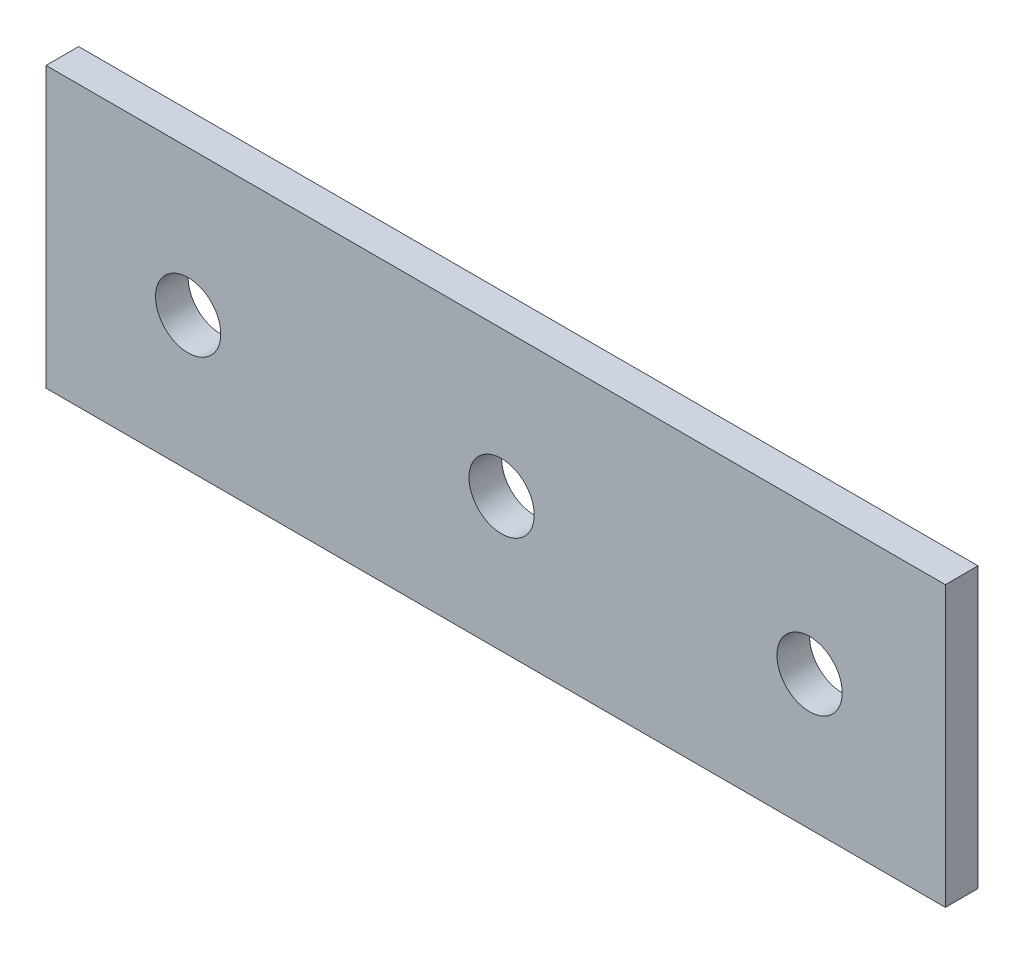
ISO-10303-21;
HEADER;
FILE_DESCRIPTION(('STEP AP214'),'2;1');
FILE_NAME('part.step','',(''),(''),'','','');
FILE_SCHEMA(('AUTOMOTIVE_DESIGN { 1 0 10303 214 1 1 1 1 }'));
ENDSEC;
DATA;
#1=APPLICATION_CONTEXT('core data for automotive mechanical design processes');
#2=APPLICATION_PROTOCOL_DEFINITION('international standard','automotive_design',2000,#1);
#3=PRODUCT_CONTEXT('',#1,'mechanical');
#4=PRODUCT('Part','Part','',(#3));
#5=PRODUCT_RELATED_PRODUCT_CATEGORY('part','',(#4));
#6=PRODUCT_DEFINITION_FORMATION('','',#4);
#7=PRODUCT_DEFINITION_CONTEXT('part definition',#1,'design');
#8=PRODUCT_DEFINITION('design','',#6,#7);
#9=PRODUCT_DEFINITION_SHAPE('','',#8);
#10=(LENGTH_UNIT() NAMED_UNIT(*) SI_UNIT(.MILLI.,.METRE.));
#11=(NAMED_UNIT(*) PLANE_ANGLE_UNIT() SI_UNIT($,.RADIAN.));
#12=(NAMED_UNIT(*) SI_UNIT($,.STERADIAN.) SOLID_ANGLE_UNIT());
#13=UNCERTAINTY_MEASURE_WITH_UNIT(LENGTH_MEASURE(1.E-05),#10,'distance_accuracy_value','');
#14=(GEOMETRIC_REPRESENTATION_CONTEXT(3) GLOBAL_UNCERTAINTY_ASSIGNED_CONTEXT((#13)) GLOBAL_UNIT_ASSIGNED_CONTEXT((#10,
#11,#12)) REPRESENTATION_CONTEXT('',''));
#15=CARTESIAN_POINT('',(0.,0.,0.));
#16=DIRECTION('',(0.,0.,1.));
#17=DIRECTION('',(1.,0.,0.));
#18=AXIS2_PLACEMENT_3D('',#15,#16,#17);
#19=CARTESIAN_POINT('',(0.,0.,10.));
#20=DIRECTION('',(0.,0.,1.));
#21=DIRECTION('',(1.,0.,0.));
#22=AXIS2_PLACEMENT_3D('',#19,#20,#21);
#23=PLANE('',#22);
#24=CARTESIAN_POINT('',(37.9860326953949,9.07309698138412,10.));
#25=DIRECTION('',(0.,0.,1.));
#26=DIRECTION('',(1.,0.,0.));
#27=AXIS2_PLACEMENT_3D('',#24,#25,#26);
#28=CIRCLE('',#27,10.);
#29=CARTESIAN_POINT('',(47.9860326953949,9.07309698138412,10.));
#30=VERTEX_POINT('',#29);
#31=EDGE_CURVE('E119',#30,#30,#28,.T.);
#32=ORIENTED_EDGE('',*,*,#31,.F.);
#33=EDGE_LOOP('',(#32));
#34=FACE_BOUND('',#33,.T.);
#35=DIRECTION('',(0.,-1.,0.));
#36=VECTOR('',#35,1.);
#37=CARTESIAN_POINT('',(-101.618686191502,53.5917595033755,10.));
#38=LINE('',#37,#36);
#39=CARTESIAN_POINT('',(-101.618686191502,53.5917595033755,10.));
#40=VERTEX_POINT('',#39);
#41=CARTESIAN_POINT('',(-101.618686191502,-32.0582760008906,10.));
#42=VERTEX_POINT('',#41);
#43=EDGE_CURVE('E89',#40,#42,#38,.T.);
#44=ORIENTED_EDGE('',*,*,#43,.T.);
#45=DIRECTION('',(1.,0.,0.));
#46=VECTOR('',#45,1.);
#47=CARTESIAN_POINT('',(-101.618686191502,-32.0582760008906,10.));
#48=LINE('',#47,#46);
#49=CARTESIAN_POINT('',(173.961512789738,-32.0582760008906,10.));
#50=VERTEX_POINT('',#49);
#51=EDGE_CURVE('E84',#42,#50,#48,.T.);
#52=ORIENTED_EDGE('',*,*,#51,.T.);
#53=DIRECTION('',(0.,1.,0.));
#54=VECTOR('',#53,1.);
#55=CARTESIAN_POINT('',(173.961512789738,53.5917595033755,10.));
#56=LINE('',#55,#54);
#57=CARTESIAN_POINT('',(173.961512789738,53.5917595033755,10.));
#58=VERTEX_POINT('',#57);
#59=EDGE_CURVE('E87',#50,#58,#56,.T.);
#60=ORIENTED_EDGE('',*,*,#59,.T.);
#61=DIRECTION('',(-1.,0.,0.));
#62=VECTOR('',#61,1.);
#63=CARTESIAN_POINT('',(-101.618686191502,53.5917595033755,10.));
#64=LINE('',#63,#62);
#65=EDGE_CURVE('E54',#58,#40,#64,.T.);
#66=ORIENTED_EDGE('',*,*,#65,.T.);
#67=EDGE_LOOP('',(#44,#52,#60,#66));
#68=FACE_BOUND('',#67,.T.);
#69=CARTESIAN_POINT('',(-58.0678206808584,9.07309698138412,10.));
#70=DIRECTION('',(0.,0.,1.));
#71=DIRECTION('',(1.,0.,0.));
#72=AXIS2_PLACEMENT_3D('',#69,#70,#71);
#73=CIRCLE('',#72,10.);
#74=CARTESIAN_POINT('',(-48.0678206808584,9.07309698138412,10.));
#75=VERTEX_POINT('',#74);
#76=EDGE_CURVE('E104',#75,#75,#73,.T.);
#77=ORIENTED_EDGE('',*,*,#76,.F.);
#78=EDGE_LOOP('',(#77));
#79=FACE_BOUND('',#78,.T.);
#80=CARTESIAN_POINT('',(132.34624130179,9.07309698138412,10.));
#81=DIRECTION('',(0.,0.,1.));
#82=DIRECTION('',(1.,0.,0.));
#83=AXIS2_PLACEMENT_3D('',#80,#81,#82);
#84=CIRCLE('',#83,10.);
#85=CARTESIAN_POINT('',(142.34624130179,9.07309698138412,10.));
#86=VERTEX_POINT('',#85);
#87=EDGE_CURVE('E125',#86,#86,#84,.T.);
#88=ORIENTED_EDGE('',*,*,#87,.F.);
#89=EDGE_LOOP('',(#88));
#90=FACE_BOUND('',#89,.T.);
#91=ADVANCED_FACE('F37',(#34,#68,#79,#90),#23,.T.);
#92=CARTESIAN_POINT('',(0.,0.,0.));
#93=DIRECTION('',(0.,0.,1.));
#94=DIRECTION('',(1.,0.,0.));
#95=AXIS2_PLACEMENT_3D('',#92,#93,#94);
#96=PLANE('',#95);
#97=DIRECTION('',(0.,-1.,0.));
#98=VECTOR('',#97,1.);
#99=CARTESIAN_POINT('',(-101.618686191502,53.5917595033755,0.));
#100=LINE('',#99,#98);
#101=CARTESIAN_POINT('',(-101.618686191502,53.5917595033755,0.));
#102=VERTEX_POINT('',#101);
#103=CARTESIAN_POINT('',(-101.618686191502,-32.0582760008906,0.));
#104=VERTEX_POINT('',#103);
#105=EDGE_CURVE('E101',#102,#104,#100,.T.);
#106=ORIENTED_EDGE('',*,*,#105,.F.);
#107=DIRECTION('',(-1.,0.,0.));
#108=VECTOR('',#107,1.);
#109=CARTESIAN_POINT('',(-101.618686191502,53.5917595033755,0.));
#110=LINE('',#109,#108);
#111=CARTESIAN_POINT('',(173.961512789738,53.5917595033755,0.));
#112=VERTEX_POINT('',#111);
#113=EDGE_CURVE('E77',#112,#102,#110,.T.);
#114=ORIENTED_EDGE('',*,*,#113,.F.);
#115=DIRECTION('',(0.,1.,0.));
#116=VECTOR('',#115,1.);
#117=CARTESIAN_POINT('',(173.961512789738,53.5917595033755,0.));
#118=LINE('',#117,#116);
#119=CARTESIAN_POINT('',(173.961512789738,-32.0582760008906,0.));
#120=VERTEX_POINT('',#119);
#121=EDGE_CURVE('E71',#120,#112,#118,.T.);
#122=ORIENTED_EDGE('',*,*,#121,.F.);
#123=DIRECTION('',(1.,0.,0.));
#124=VECTOR('',#123,1.);
#125=CARTESIAN_POINT('',(-101.618686191502,-32.0582760008906,0.));
#126=LINE('',#125,#124);
#127=EDGE_CURVE('E93',#104,#120,#126,.T.);
#128=ORIENTED_EDGE('',*,*,#127,.F.);
#129=EDGE_LOOP('',(#106,#114,#122,#128));
#130=FACE_BOUND('',#129,.T.);
#131=CARTESIAN_POINT('',(-58.0678206808584,9.07309698138412,0.));
#132=DIRECTION('',(0.,0.,1.));
#133=DIRECTION('',(1.,0.,0.));
#134=AXIS2_PLACEMENT_3D('',#131,#132,#133);
#135=CIRCLE('',#134,10.);
#136=CARTESIAN_POINT('',(-48.0678206808584,9.07309698138412,0.));
#137=VERTEX_POINT('',#136);
#138=EDGE_CURVE('E116',#137,#137,#135,.T.);
#139=ORIENTED_EDGE('',*,*,#138,.T.);
#140=EDGE_LOOP('',(#139));
#141=FACE_BOUND('',#140,.T.);
#142=CARTESIAN_POINT('',(37.9860326953949,9.07309698138412,0.));
#143=DIRECTION('',(0.,0.,1.));
#144=DIRECTION('',(1.,0.,0.));
#145=AXIS2_PLACEMENT_3D('',#142,#143,#144);
#146=CIRCLE('',#145,10.);
#147=CARTESIAN_POINT('',(47.9860326953949,9.07309698138412,0.));
#148=VERTEX_POINT('',#147);
#149=EDGE_CURVE('E122',#148,#148,#146,.T.);
#150=ORIENTED_EDGE('',*,*,#149,.T.);
#151=EDGE_LOOP('',(#150));
#152=FACE_BOUND('',#151,.T.);
#153=CARTESIAN_POINT('',(132.34624130179,9.07309698138412,0.));
#154=DIRECTION('',(0.,0.,1.));
#155=DIRECTION('',(1.,0.,0.));
#156=AXIS2_PLACEMENT_3D('',#153,#154,#155);
#157=CIRCLE('',#156,10.);
#158=CARTESIAN_POINT('',(142.34624130179,9.07309698138412,0.));
#159=VERTEX_POINT('',#158);
#160=EDGE_CURVE('E128',#159,#159,#157,.T.);
#161=ORIENTED_EDGE('',*,*,#160,.T.);
#162=EDGE_LOOP('',(#161));
#163=FACE_BOUND('',#162,.T.);
#164=ADVANCED_FACE('F112',(#130,#141,#152,#163),#96,.F.);
#165=CARTESIAN_POINT('',(-101.618686191502,53.5917595033755,10.));
#166=DIRECTION('',(1.,0.,0.));
#167=DIRECTION('',(0.,0.,-1.));
#168=AXIS2_PLACEMENT_3D('',#165,#166,#167);
#169=PLANE('',#168);
#170=ORIENTED_EDGE('',*,*,#105,.T.);
#171=DIRECTION('',(0.,0.,-1.));
#172=VECTOR('',#171,1.);
#173=CARTESIAN_POINT('',(-101.618686191502,-32.0582760008906,10.));
#174=LINE('',#173,#172);
#175=EDGE_CURVE('E11',#42,#104,#174,.T.);
#176=ORIENTED_EDGE('',*,*,#175,.F.);
#177=ORIENTED_EDGE('',*,*,#43,.F.);
#178=DIRECTION('',(0.,0.,-1.));
#179=VECTOR('',#178,1.);
#180=CARTESIAN_POINT('',(-101.618686191502,53.5917595033755,10.));
#181=LINE('',#180,#179);
#182=EDGE_CURVE('E97',#40,#102,#181,.T.);
#183=ORIENTED_EDGE('',*,*,#182,.T.);
#184=EDGE_LOOP('',(#170,#176,#177,#183));
#185=FACE_BOUND('',#184,.T.);
#186=ADVANCED_FACE('F39',(#185),#169,.F.);
#187=CARTESIAN_POINT('',(-101.618686191502,-32.0582760008906,10.));
#188=DIRECTION('',(0.,1.,0.));
#189=DIRECTION('',(0.,0.,1.));
#190=AXIS2_PLACEMENT_3D('',#187,#188,#189);
#191=PLANE('',#190);
#192=ORIENTED_EDGE('',*,*,#127,.T.);
#193=DIRECTION('',(0.,0.,-1.));
#194=VECTOR('',#193,1.);
#195=CARTESIAN_POINT('',(173.961512789738,-32.0582760008906,10.));
#196=LINE('',#195,#194);
#197=EDGE_CURVE('E46',#50,#120,#196,.T.);
#198=ORIENTED_EDGE('',*,*,#197,.F.);
#199=ORIENTED_EDGE('',*,*,#51,.F.);
#200=ORIENTED_EDGE('',*,*,#175,.T.);
#201=EDGE_LOOP('',(#192,#198,#199,#200));
#202=FACE_BOUND('',#201,.T.);
#203=ADVANCED_FACE('F92',(#202),#191,.F.);
#204=CARTESIAN_POINT('',(173.961512789738,53.5917595033755,10.));
#205=DIRECTION('',(-1.,0.,0.));
#206=DIRECTION('',(0.,0.,1.));
#207=AXIS2_PLACEMENT_3D('',#204,#205,#206);
#208=PLANE('',#207);
#209=ORIENTED_EDGE('',*,*,#121,.T.);
#210=DIRECTION('',(0.,0.,-1.));
#211=VECTOR('',#210,1.);
#212=CARTESIAN_POINT('',(173.961512789738,53.5917595033755,10.));
#213=LINE('',#212,#211);
#214=EDGE_CURVE('E94',#58,#112,#213,.T.);
#215=ORIENTED_EDGE('',*,*,#214,.F.);
#216=ORIENTED_EDGE('',*,*,#59,.F.);
#217=ORIENTED_EDGE('',*,*,#197,.T.);
#218=EDGE_LOOP('',(#209,#215,#216,#217));
#219=FACE_BOUND('',#218,.T.);
#220=ADVANCED_FACE('F95',(#219),#208,.F.);
#221=CARTESIAN_POINT('',(-101.618686191502,53.5917595033755,10.));
#222=DIRECTION('',(0.,-1.,0.));
#223=DIRECTION('',(0.,0.,-1.));
#224=AXIS2_PLACEMENT_3D('',#221,#222,#223);
#225=PLANE('',#224);
#226=ORIENTED_EDGE('',*,*,#113,.T.);
#227=ORIENTED_EDGE('',*,*,#182,.F.);
#228=ORIENTED_EDGE('',*,*,#65,.F.);
#229=ORIENTED_EDGE('',*,*,#214,.T.);
#230=EDGE_LOOP('',(#226,#227,#228,#229));
#231=FACE_BOUND('',#230,.T.);
#232=ADVANCED_FACE('F109',(#231),#225,.F.);
#233=CARTESIAN_POINT('',(-58.0678206808584,9.07309698138412,10.));
#234=DIRECTION('',(0.,0.,-1.));
#235=DIRECTION('',(-1.,0.,0.));
#236=AXIS2_PLACEMENT_3D('',#233,#234,#235);
#237=CYLINDRICAL_SURFACE('',#236,10.);
#238=ORIENTED_EDGE('',*,*,#76,.T.);
#239=EDGE_LOOP('',(#238));
#240=FACE_BOUND('',#239,.T.);
#241=ORIENTED_EDGE('',*,*,#138,.F.);
#242=EDGE_LOOP('',(#241));
#243=FACE_BOUND('',#242,.T.);
#244=ADVANCED_FACE('F146',(#240,#243),#237,.F.);
#245=CARTESIAN_POINT('',(37.9860326953949,9.07309698138412,10.));
#246=DIRECTION('',(0.,0.,-1.));
#247=DIRECTION('',(-1.,0.,0.));
#248=AXIS2_PLACEMENT_3D('',#245,#246,#247);
#249=CYLINDRICAL_SURFACE('',#248,10.);
#250=ORIENTED_EDGE('',*,*,#31,.T.);
#251=EDGE_LOOP('',(#250));
#252=FACE_BOUND('',#251,.T.);
#253=ORIENTED_EDGE('',*,*,#149,.F.);
#254=EDGE_LOOP('',(#253));
#255=FACE_BOUND('',#254,.T.);
#256=ADVANCED_FACE('F200',(#252,#255),#249,.F.);
#257=CARTESIAN_POINT('',(132.34624130179,9.07309698138412,10.));
#258=DIRECTION('',(0.,0.,-1.));
#259=DIRECTION('',(-1.,0.,0.));
#260=AXIS2_PLACEMENT_3D('',#257,#258,#259);
#261=CYLINDRICAL_SURFACE('',#260,10.);
#262=ORIENTED_EDGE('',*,*,#87,.T.);
#263=EDGE_LOOP('',(#262));
#264=FACE_BOUND('',#263,.T.);
#265=ORIENTED_EDGE('',*,*,#160,.F.);
#266=EDGE_LOOP('',(#265));
#267=FACE_BOUND('',#266,.T.);
#268=ADVANCED_FACE('F134',(#264,#267),#261,.F.);
#269=CLOSED_SHELL('',(#91,#164,#186,#203,#220,#232,#244,#256,#268));
#270=MANIFOLD_SOLID_BREP('B2',#269);
#271=ADVANCED_BREP_SHAPE_REPRESENTATION('',(#18,#270),#14);
#272=SHAPE_DEFINITION_REPRESENTATION(#9,#271);
ENDSEC;
END-ISO-10303-21;
